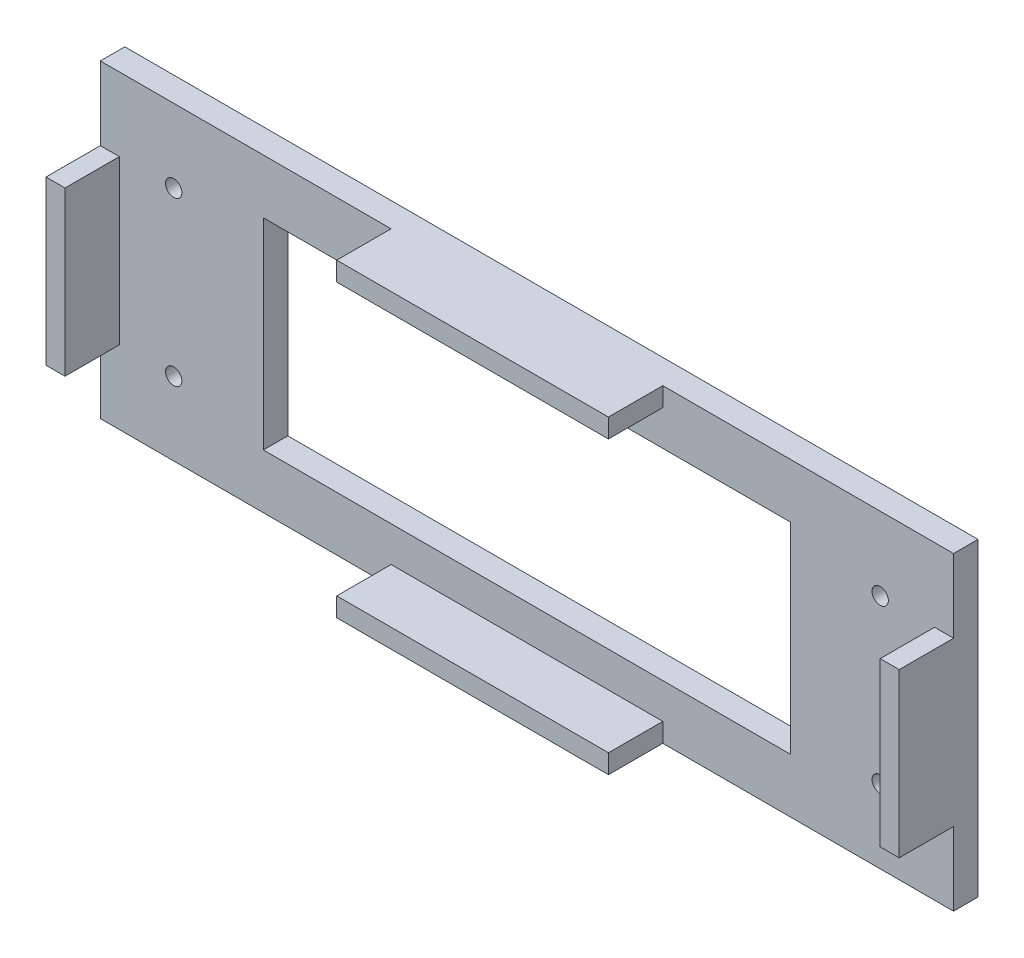
ISO-10303-21;
HEADER;
FILE_DESCRIPTION(('STEP AP214'),'2;1');
FILE_NAME('part.step','',(''),(''),'','','');
FILE_SCHEMA(('AUTOMOTIVE_DESIGN { 1 0 10303 214 1 1 1 1 }'));
ENDSEC;
DATA;
#1=APPLICATION_CONTEXT('core data for automotive mechanical design processes');
#2=APPLICATION_PROTOCOL_DEFINITION('international standard','automotive_design',2000,#1);
#3=PRODUCT_CONTEXT('',#1,'mechanical');
#4=PRODUCT('Part','Part','',(#3));
#5=PRODUCT_RELATED_PRODUCT_CATEGORY('part','',(#4));
#6=PRODUCT_DEFINITION_FORMATION('','',#4);
#7=PRODUCT_DEFINITION_CONTEXT('part definition',#1,'design');
#8=PRODUCT_DEFINITION('design','',#6,#7);
#9=PRODUCT_DEFINITION_SHAPE('','',#8);
#10=(LENGTH_UNIT() NAMED_UNIT(*) SI_UNIT(.MILLI.,.METRE.));
#11=(NAMED_UNIT(*) PLANE_ANGLE_UNIT() SI_UNIT($,.RADIAN.));
#12=(NAMED_UNIT(*) SI_UNIT($,.STERADIAN.) SOLID_ANGLE_UNIT());
#13=UNCERTAINTY_MEASURE_WITH_UNIT(LENGTH_MEASURE(1.E-05),#10,'distance_accuracy_value','');
#14=(GEOMETRIC_REPRESENTATION_CONTEXT(3) GLOBAL_UNCERTAINTY_ASSIGNED_CONTEXT((#13)) GLOBAL_UNIT_ASSIGNED_CONTEXT((#10,
#11,#12)) REPRESENTATION_CONTEXT('',''));
#15=CARTESIAN_POINT('',(0.,0.,0.));
#16=DIRECTION('',(0.,0.,1.));
#17=DIRECTION('',(1.,0.,0.));
#18=AXIS2_PLACEMENT_3D('',#15,#16,#17);
#19=CARTESIAN_POINT('',(0.,0.,4.5));
#20=DIRECTION('',(0.,0.,1.));
#21=DIRECTION('',(1.,0.,0.));
#22=AXIS2_PLACEMENT_3D('',#19,#20,#21);
#23=PLANE('',#22);
#24=CARTESIAN_POINT('',(-65.,-15.,4.5));
#25=DIRECTION('',(0.,0.,1.));
#26=DIRECTION('',(1.,0.,0.));
#27=AXIS2_PLACEMENT_3D('',#24,#25,#26);
#28=CIRCLE('',#27,1.5);
#29=CARTESIAN_POINT('',(-63.5,-15.,4.5));
#30=VERTEX_POINT('',#29);
#31=EDGE_CURVE('E349',#30,#30,#28,.T.);
#32=ORIENTED_EDGE('',*,*,#31,.F.);
#33=EDGE_LOOP('',(#32));
#34=FACE_BOUND('',#33,.T.);
#35=CARTESIAN_POINT('',(-65.,15.,4.5));
#36=DIRECTION('',(0.,0.,1.));
#37=DIRECTION('',(1.,0.,0.));
#38=AXIS2_PLACEMENT_3D('',#35,#36,#37);
#39=CIRCLE('',#38,1.5);
#40=CARTESIAN_POINT('',(-63.5,15.,4.5));
#41=VERTEX_POINT('',#40);
#42=EDGE_CURVE('E361',#41,#41,#39,.T.);
#43=ORIENTED_EDGE('',*,*,#42,.F.);
#44=EDGE_LOOP('',(#43));
#45=FACE_BOUND('',#44,.T.);
#46=CARTESIAN_POINT('',(65.,15.,4.5));
#47=DIRECTION('',(0.,0.,1.));
#48=DIRECTION('',(1.,0.,0.));
#49=AXIS2_PLACEMENT_3D('',#46,#47,#48);
#50=CIRCLE('',#49,1.5);
#51=CARTESIAN_POINT('',(66.5,15.,4.5));
#52=VERTEX_POINT('',#51);
#53=EDGE_CURVE('E355',#52,#52,#50,.T.);
#54=ORIENTED_EDGE('',*,*,#53,.F.);
#55=EDGE_LOOP('',(#54));
#56=FACE_BOUND('',#55,.T.);
#57=CARTESIAN_POINT('',(65.,-15.,4.5));
#58=DIRECTION('',(0.,0.,1.));
#59=DIRECTION('',(1.,0.,0.));
#60=AXIS2_PLACEMENT_3D('',#57,#58,#59);
#61=CIRCLE('',#60,1.5);
#62=CARTESIAN_POINT('',(66.5,-15.,4.5));
#63=VERTEX_POINT('',#62);
#64=EDGE_CURVE('E343',#63,#63,#61,.T.);
#65=ORIENTED_EDGE('',*,*,#64,.F.);
#66=EDGE_LOOP('',(#65));
#67=FACE_BOUND('',#66,.T.);
#68=DIRECTION('',(-1.,0.,0.));
#69=VECTOR('',#68,1.);
#70=CARTESIAN_POINT('',(-48.5,18.5,4.5));
#71=LINE('',#70,#69);
#72=CARTESIAN_POINT('',(48.5,18.5,4.5));
#73=VERTEX_POINT('',#72);
#74=CARTESIAN_POINT('',(-48.5,18.5,4.5));
#75=VERTEX_POINT('',#74);
#76=EDGE_CURVE('E314',#73,#75,#71,.T.);
#77=ORIENTED_EDGE('',*,*,#76,.F.);
#78=DIRECTION('',(0.,1.,0.));
#79=VECTOR('',#78,1.);
#80=CARTESIAN_POINT('',(48.5,18.5,4.5));
#81=LINE('',#80,#79);
#82=CARTESIAN_POINT('',(48.5,-18.5,4.5));
#83=VERTEX_POINT('',#82);
#84=EDGE_CURVE('E312',#83,#73,#81,.T.);
#85=ORIENTED_EDGE('',*,*,#84,.F.);
#86=DIRECTION('',(1.,0.,0.));
#87=VECTOR('',#86,1.);
#88=CARTESIAN_POINT('',(-48.5,-18.5,4.5));
#89=LINE('',#88,#87);
#90=CARTESIAN_POINT('',(-48.5,-18.5,4.5));
#91=VERTEX_POINT('',#90);
#92=EDGE_CURVE('E320',#91,#83,#89,.T.);
#93=ORIENTED_EDGE('',*,*,#92,.F.);
#94=DIRECTION('',(0.,-1.,0.));
#95=VECTOR('',#94,1.);
#96=CARTESIAN_POINT('',(-48.5,18.5,4.5));
#97=LINE('',#96,#95);
#98=EDGE_CURVE('E317',#75,#91,#97,.T.);
#99=ORIENTED_EDGE('',*,*,#98,.F.);
#100=EDGE_LOOP('',(#77,#85,#93,#99));
#101=FACE_BOUND('',#100,.T.);
#102=DIRECTION('',(-1.,0.,0.));
#103=VECTOR('',#102,1.);
#104=CARTESIAN_POINT('',(-25.,-25.,4.5));
#105=LINE('',#104,#103);
#106=CARTESIAN_POINT('',(25.,-25.,4.5));
#107=VERTEX_POINT('',#106);
#108=CARTESIAN_POINT('',(-25.,-25.,4.5));
#109=VERTEX_POINT('',#108);
#110=EDGE_CURVE('E49',#107,#109,#105,.T.);
#111=ORIENTED_EDGE('',*,*,#110,.F.);
#112=DIRECTION('',(0.,1.,0.));
#113=VECTOR('',#112,1.);
#114=CARTESIAN_POINT('',(25.,-25.,4.5));
#115=LINE('',#114,#113);
#116=CARTESIAN_POINT('',(25.,-28.5,4.5));
#117=VERTEX_POINT('',#116);
#118=EDGE_CURVE('E215',#117,#107,#115,.T.);
#119=ORIENTED_EDGE('',*,*,#118,.F.);
#120=DIRECTION('',(1.,0.,0.));
#121=VECTOR('',#120,1.);
#122=CARTESIAN_POINT('',(-78.5,-28.5,4.5));
#123=LINE('',#122,#121);
#124=CARTESIAN_POINT('',(78.5,-28.5,4.5));
#125=VERTEX_POINT('',#124);
#126=EDGE_CURVE('E376',#117,#125,#123,.T.);
#127=ORIENTED_EDGE('',*,*,#126,.T.);
#128=DIRECTION('',(0.,1.,0.));
#129=VECTOR('',#128,1.);
#130=CARTESIAN_POINT('',(78.5,28.5,4.5));
#131=LINE('',#130,#129);
#132=CARTESIAN_POINT('',(78.5,-15.,4.5));
#133=VERTEX_POINT('',#132);
#134=EDGE_CURVE('E367',#125,#133,#131,.T.);
#135=ORIENTED_EDGE('',*,*,#134,.T.);
#136=DIRECTION('',(1.,0.,0.));
#137=VECTOR('',#136,1.);
#138=CARTESIAN_POINT('',(75.,-15.,4.5));
#139=LINE('',#138,#137);
#140=CARTESIAN_POINT('',(75.,-15.,4.5));
#141=VERTEX_POINT('',#140);
#142=EDGE_CURVE('E256',#141,#133,#139,.T.);
#143=ORIENTED_EDGE('',*,*,#142,.F.);
#144=DIRECTION('',(0.,-1.,0.));
#145=VECTOR('',#144,1.);
#146=CARTESIAN_POINT('',(75.,-15.,4.5));
#147=LINE('',#146,#145);
#148=CARTESIAN_POINT('',(75.,15.,4.5));
#149=VERTEX_POINT('',#148);
#150=EDGE_CURVE('E265',#149,#141,#147,.T.);
#151=ORIENTED_EDGE('',*,*,#150,.F.);
#152=DIRECTION('',(-1.,0.,0.));
#153=VECTOR('',#152,1.);
#154=CARTESIAN_POINT('',(75.,15.,4.5));
#155=LINE('',#154,#153);
#156=CARTESIAN_POINT('',(78.5,15.,4.5));
#157=VERTEX_POINT('',#156);
#158=EDGE_CURVE('E251',#157,#149,#155,.T.);
#159=ORIENTED_EDGE('',*,*,#158,.F.);
#160=CARTESIAN_POINT('',(78.5,28.5,4.5));
#161=VERTEX_POINT('',#160);
#162=EDGE_CURVE('E370',#157,#161,#131,.T.);
#163=ORIENTED_EDGE('',*,*,#162,.T.);
#164=DIRECTION('',(-1.,0.,0.));
#165=VECTOR('',#164,1.);
#166=CARTESIAN_POINT('',(-78.5,28.5,4.5));
#167=LINE('',#166,#165);
#168=CARTESIAN_POINT('',(25.,28.5,4.5));
#169=VERTEX_POINT('',#168);
#170=EDGE_CURVE('E371',#161,#169,#167,.T.);
#171=ORIENTED_EDGE('',*,*,#170,.T.);
#172=DIRECTION('',(0.,1.,0.));
#173=VECTOR('',#172,1.);
#174=CARTESIAN_POINT('',(25.,25.,4.5));
#175=LINE('',#174,#173);
#176=CARTESIAN_POINT('',(25.,25.,4.5));
#177=VERTEX_POINT('',#176);
#178=EDGE_CURVE('E216',#177,#169,#175,.T.);
#179=ORIENTED_EDGE('',*,*,#178,.F.);
#180=DIRECTION('',(1.,0.,0.));
#181=VECTOR('',#180,1.);
#182=CARTESIAN_POINT('',(-25.,25.,4.5));
#183=LINE('',#182,#181);
#184=CARTESIAN_POINT('',(-25.,25.,4.5));
#185=VERTEX_POINT('',#184);
#186=EDGE_CURVE('E229',#185,#177,#183,.T.);
#187=ORIENTED_EDGE('',*,*,#186,.F.);
#188=DIRECTION('',(0.,-1.,0.));
#189=VECTOR('',#188,1.);
#190=CARTESIAN_POINT('',(-25.,25.,4.5));
#191=LINE('',#190,#189);
#192=CARTESIAN_POINT('',(-25.,28.5,4.5));
#193=VERTEX_POINT('',#192);
#194=EDGE_CURVE('E219',#193,#185,#191,.T.);
#195=ORIENTED_EDGE('',*,*,#194,.F.);
#196=CARTESIAN_POINT('',(-78.5,28.5,4.5));
#197=VERTEX_POINT('',#196);
#198=EDGE_CURVE('E369',#193,#197,#167,.T.);
#199=ORIENTED_EDGE('',*,*,#198,.T.);
#200=DIRECTION('',(0.,-1.,0.));
#201=VECTOR('',#200,1.);
#202=CARTESIAN_POINT('',(-78.5,28.5,4.5));
#203=LINE('',#202,#201);
#204=CARTESIAN_POINT('',(-78.5,15.,4.5));
#205=VERTEX_POINT('',#204);
#206=EDGE_CURVE('E374',#197,#205,#203,.T.);
#207=ORIENTED_EDGE('',*,*,#206,.T.);
#208=DIRECTION('',(-1.,0.,0.));
#209=VECTOR('',#208,1.);
#210=CARTESIAN_POINT('',(-75.,15.,4.5));
#211=LINE('',#210,#209);
#212=CARTESIAN_POINT('',(-75.,15.,4.5));
#213=VERTEX_POINT('',#212);
#214=EDGE_CURVE('E286',#213,#205,#211,.T.);
#215=ORIENTED_EDGE('',*,*,#214,.F.);
#216=DIRECTION('',(0.,1.,0.));
#217=VECTOR('',#216,1.);
#218=CARTESIAN_POINT('',(-75.,-15.,4.5));
#219=LINE('',#218,#217);
#220=CARTESIAN_POINT('',(-75.,-15.,4.5));
#221=VERTEX_POINT('',#220);
#222=EDGE_CURVE('E295',#221,#213,#219,.T.);
#223=ORIENTED_EDGE('',*,*,#222,.F.);
#224=DIRECTION('',(1.,0.,0.));
#225=VECTOR('',#224,1.);
#226=CARTESIAN_POINT('',(-75.,-15.,4.5));
#227=LINE('',#226,#225);
#228=CARTESIAN_POINT('',(-78.5,-15.,4.5));
#229=VERTEX_POINT('',#228);
#230=EDGE_CURVE('E281',#229,#221,#227,.T.);
#231=ORIENTED_EDGE('',*,*,#230,.F.);
#232=CARTESIAN_POINT('',(-78.5,-28.5,4.5));
#233=VERTEX_POINT('',#232);
#234=EDGE_CURVE('E373',#229,#233,#203,.T.);
#235=ORIENTED_EDGE('',*,*,#234,.T.);
#236=CARTESIAN_POINT('',(-25.,-28.5,4.5));
#237=VERTEX_POINT('',#236);
#238=EDGE_CURVE('E377',#233,#237,#123,.T.);
#239=ORIENTED_EDGE('',*,*,#238,.T.);
#240=DIRECTION('',(0.,-1.,0.));
#241=VECTOR('',#240,1.);
#242=CARTESIAN_POINT('',(-25.,-25.,4.5));
#243=LINE('',#242,#241);
#244=EDGE_CURVE('E54',#109,#237,#243,.T.);
#245=ORIENTED_EDGE('',*,*,#244,.F.);
#246=EDGE_LOOP('',(#111,#119,#127,#135,#143,#151,#159,#163,#171,#179,#187,#195,#199,#207,#215,
#223,#231,#235,#239,#245));
#247=FACE_BOUND('',#246,.T.);
#248=ADVANCED_FACE('F34',(#34,#45,#56,#67,#101,#247),#23,.T.);
#249=CARTESIAN_POINT('',(0.,0.,0.));
#250=DIRECTION('',(0.,0.,1.));
#251=DIRECTION('',(1.,0.,0.));
#252=AXIS2_PLACEMENT_3D('',#249,#250,#251);
#253=PLANE('',#252);
#254=CARTESIAN_POINT('',(65.,-15.,0.));
#255=DIRECTION('',(0.,0.,1.));
#256=DIRECTION('',(1.,0.,0.));
#257=AXIS2_PLACEMENT_3D('',#254,#255,#256);
#258=CIRCLE('',#257,1.5);
#259=CARTESIAN_POINT('',(66.5,-15.,0.));
#260=VERTEX_POINT('',#259);
#261=EDGE_CURVE('E342',#260,#260,#258,.T.);
#262=ORIENTED_EDGE('',*,*,#261,.T.);
#263=EDGE_LOOP('',(#262));
#264=FACE_BOUND('',#263,.T.);
#265=CARTESIAN_POINT('',(-65.,-15.,0.));
#266=DIRECTION('',(0.,0.,1.));
#267=DIRECTION('',(1.,0.,0.));
#268=AXIS2_PLACEMENT_3D('',#265,#266,#267);
#269=CIRCLE('',#268,1.5);
#270=CARTESIAN_POINT('',(-63.5,-15.,0.));
#271=VERTEX_POINT('',#270);
#272=EDGE_CURVE('E346',#271,#271,#269,.T.);
#273=ORIENTED_EDGE('',*,*,#272,.T.);
#274=EDGE_LOOP('',(#273));
#275=FACE_BOUND('',#274,.T.);
#276=CARTESIAN_POINT('',(65.,15.,0.));
#277=DIRECTION('',(0.,0.,1.));
#278=DIRECTION('',(1.,0.,0.));
#279=AXIS2_PLACEMENT_3D('',#276,#277,#278);
#280=CIRCLE('',#279,1.5);
#281=CARTESIAN_POINT('',(66.5,15.,0.));
#282=VERTEX_POINT('',#281);
#283=EDGE_CURVE('E352',#282,#282,#280,.T.);
#284=ORIENTED_EDGE('',*,*,#283,.T.);
#285=EDGE_LOOP('',(#284));
#286=FACE_BOUND('',#285,.T.);
#287=CARTESIAN_POINT('',(-65.,15.,0.));
#288=DIRECTION('',(0.,0.,1.));
#289=DIRECTION('',(1.,0.,0.));
#290=AXIS2_PLACEMENT_3D('',#287,#288,#289);
#291=CIRCLE('',#290,1.5);
#292=CARTESIAN_POINT('',(-63.5,15.,0.));
#293=VERTEX_POINT('',#292);
#294=EDGE_CURVE('E358',#293,#293,#291,.T.);
#295=ORIENTED_EDGE('',*,*,#294,.T.);
#296=EDGE_LOOP('',(#295));
#297=FACE_BOUND('',#296,.T.);
#298=DIRECTION('',(0.,1.,0.));
#299=VECTOR('',#298,1.);
#300=CARTESIAN_POINT('',(78.5,28.5,0.));
#301=LINE('',#300,#299);
#302=CARTESIAN_POINT('',(78.5,-28.5,0.));
#303=VERTEX_POINT('',#302);
#304=CARTESIAN_POINT('',(78.5,28.5,0.));
#305=VERTEX_POINT('',#304);
#306=EDGE_CURVE('E364',#303,#305,#301,.T.);
#307=ORIENTED_EDGE('',*,*,#306,.F.);
#308=DIRECTION('',(1.,0.,0.));
#309=VECTOR('',#308,1.);
#310=CARTESIAN_POINT('',(-78.5,-28.5,0.));
#311=LINE('',#310,#309);
#312=CARTESIAN_POINT('',(-78.5,-28.5,0.));
#313=VERTEX_POINT('',#312);
#314=EDGE_CURVE('E386',#313,#303,#311,.T.);
#315=ORIENTED_EDGE('',*,*,#314,.F.);
#316=DIRECTION('',(0.,-1.,0.));
#317=VECTOR('',#316,1.);
#318=CARTESIAN_POINT('',(-78.5,28.5,0.));
#319=LINE('',#318,#317);
#320=CARTESIAN_POINT('',(-78.5,28.5,0.));
#321=VERTEX_POINT('',#320);
#322=EDGE_CURVE('E384',#321,#313,#319,.T.);
#323=ORIENTED_EDGE('',*,*,#322,.F.);
#324=DIRECTION('',(-1.,0.,0.));
#325=VECTOR('',#324,1.);
#326=CARTESIAN_POINT('',(-78.5,28.5,0.));
#327=LINE('',#326,#325);
#328=EDGE_CURVE('E382',#305,#321,#327,.T.);
#329=ORIENTED_EDGE('',*,*,#328,.F.);
#330=EDGE_LOOP('',(#307,#315,#323,#329));
#331=FACE_BOUND('',#330,.T.);
#332=DIRECTION('',(0.,1.,0.));
#333=VECTOR('',#332,1.);
#334=CARTESIAN_POINT('',(48.5,18.5,0.));
#335=LINE('',#334,#333);
#336=CARTESIAN_POINT('',(48.5,-18.5,0.));
#337=VERTEX_POINT('',#336);
#338=CARTESIAN_POINT('',(48.5,18.5,0.));
#339=VERTEX_POINT('',#338);
#340=EDGE_CURVE('E311',#337,#339,#335,.T.);
#341=ORIENTED_EDGE('',*,*,#340,.T.);
#342=DIRECTION('',(-1.,0.,0.));
#343=VECTOR('',#342,1.);
#344=CARTESIAN_POINT('',(-48.5,18.5,0.));
#345=LINE('',#344,#343);
#346=CARTESIAN_POINT('',(-48.5,18.5,0.));
#347=VERTEX_POINT('',#346);
#348=EDGE_CURVE('E325',#339,#347,#345,.T.);
#349=ORIENTED_EDGE('',*,*,#348,.T.);
#350=DIRECTION('',(0.,-1.,0.));
#351=VECTOR('',#350,1.);
#352=CARTESIAN_POINT('',(-48.5,18.5,0.));
#353=LINE('',#352,#351);
#354=CARTESIAN_POINT('',(-48.5,-18.5,0.));
#355=VERTEX_POINT('',#354);
#356=EDGE_CURVE('E328',#347,#355,#353,.T.);
#357=ORIENTED_EDGE('',*,*,#356,.T.);
#358=DIRECTION('',(1.,0.,0.));
#359=VECTOR('',#358,1.);
#360=CARTESIAN_POINT('',(-48.5,-18.5,0.));
#361=LINE('',#360,#359);
#362=EDGE_CURVE('E315',#355,#337,#361,.T.);
#363=ORIENTED_EDGE('',*,*,#362,.T.);
#364=EDGE_LOOP('',(#341,#349,#357,#363));
#365=FACE_BOUND('',#364,.T.);
#366=ADVANCED_FACE('F403',(#264,#275,#286,#297,#331,#365),#253,.F.);
#367=CARTESIAN_POINT('',(78.5,28.5,4.5));
#368=DIRECTION('',(-1.,0.,0.));
#369=DIRECTION('',(0.,0.,1.));
#370=AXIS2_PLACEMENT_3D('',#367,#368,#369);
#371=PLANE('',#370);
#372=ORIENTED_EDGE('',*,*,#306,.T.);
#373=DIRECTION('',(0.,0.,-1.));
#374=VECTOR('',#373,1.);
#375=CARTESIAN_POINT('',(78.5,28.5,4.5));
#376=LINE('',#375,#374);
#377=EDGE_CURVE('E11',#161,#305,#376,.T.);
#378=ORIENTED_EDGE('',*,*,#377,.F.);
#379=ORIENTED_EDGE('',*,*,#162,.F.);
#380=DIRECTION('',(0.,0.,-1.));
#381=VECTOR('',#380,1.);
#382=CARTESIAN_POINT('',(78.5,15.,14.5));
#383=LINE('',#382,#381);
#384=CARTESIAN_POINT('',(78.5,15.,14.5));
#385=VERTEX_POINT('',#384);
#386=EDGE_CURVE('E278',#385,#157,#383,.T.);
#387=ORIENTED_EDGE('',*,*,#386,.F.);
#388=DIRECTION('',(0.,1.,0.));
#389=VECTOR('',#388,1.);
#390=CARTESIAN_POINT('',(78.5,-15.,14.5));
#391=LINE('',#390,#389);
#392=CARTESIAN_POINT('',(78.5,-15.,14.5));
#393=VERTEX_POINT('',#392);
#394=EDGE_CURVE('E252',#393,#385,#391,.T.);
#395=ORIENTED_EDGE('',*,*,#394,.F.);
#396=DIRECTION('',(0.,0.,-1.));
#397=VECTOR('',#396,1.);
#398=CARTESIAN_POINT('',(78.5,-15.,14.5));
#399=LINE('',#398,#397);
#400=EDGE_CURVE('E262',#393,#133,#399,.T.);
#401=ORIENTED_EDGE('',*,*,#400,.T.);
#402=ORIENTED_EDGE('',*,*,#134,.F.);
#403=DIRECTION('',(0.,0.,-1.));
#404=VECTOR('',#403,1.);
#405=CARTESIAN_POINT('',(78.5,-28.5,4.5));
#406=LINE('',#405,#404);
#407=EDGE_CURVE('E379',#125,#303,#406,.T.);
#408=ORIENTED_EDGE('',*,*,#407,.T.);
#409=EDGE_LOOP('',(#372,#378,#379,#387,#395,#401,#402,#408));
#410=FACE_BOUND('',#409,.T.);
#411=ADVANCED_FACE('F36',(#410),#371,.F.);
#412=CARTESIAN_POINT('',(-78.5,28.5,4.5));
#413=DIRECTION('',(0.,-1.,0.));
#414=DIRECTION('',(0.,0.,-1.));
#415=AXIS2_PLACEMENT_3D('',#412,#413,#414);
#416=PLANE('',#415);
#417=ORIENTED_EDGE('',*,*,#328,.T.);
#418=DIRECTION('',(0.,0.,-1.));
#419=VECTOR('',#418,1.);
#420=CARTESIAN_POINT('',(-78.5,28.5,4.5));
#421=LINE('',#420,#419);
#422=EDGE_CURVE('E42',#197,#321,#421,.T.);
#423=ORIENTED_EDGE('',*,*,#422,.F.);
#424=ORIENTED_EDGE('',*,*,#198,.F.);
#425=DIRECTION('',(0.,0.,-1.));
#426=VECTOR('',#425,1.);
#427=CARTESIAN_POINT('',(-25.,28.5,14.5));
#428=LINE('',#427,#426);
#429=CARTESIAN_POINT('',(-25.,28.5,14.5));
#430=VERTEX_POINT('',#429);
#431=EDGE_CURVE('E245',#430,#193,#428,.T.);
#432=ORIENTED_EDGE('',*,*,#431,.F.);
#433=DIRECTION('',(-1.,0.,0.));
#434=VECTOR('',#433,1.);
#435=CARTESIAN_POINT('',(-25.,28.5,14.5));
#436=LINE('',#435,#434);
#437=CARTESIAN_POINT('',(25.,28.5,14.5));
#438=VERTEX_POINT('',#437);
#439=EDGE_CURVE('E228',#438,#430,#436,.T.);
#440=ORIENTED_EDGE('',*,*,#439,.F.);
#441=DIRECTION('',(0.,0.,-1.));
#442=VECTOR('',#441,1.);
#443=CARTESIAN_POINT('',(25.,28.5,14.5));
#444=LINE('',#443,#442);
#445=EDGE_CURVE('E248',#438,#169,#444,.T.);
#446=ORIENTED_EDGE('',*,*,#445,.T.);
#447=ORIENTED_EDGE('',*,*,#170,.F.);
#448=ORIENTED_EDGE('',*,*,#377,.T.);
#449=EDGE_LOOP('',(#417,#423,#424,#432,#440,#446,#447,#448));
#450=FACE_BOUND('',#449,.T.);
#451=ADVANCED_FACE('F427',(#450),#416,.F.);
#452=CARTESIAN_POINT('',(-78.5,28.5,4.5));
#453=DIRECTION('',(1.,0.,0.));
#454=DIRECTION('',(0.,0.,-1.));
#455=AXIS2_PLACEMENT_3D('',#452,#453,#454);
#456=PLANE('',#455);
#457=ORIENTED_EDGE('',*,*,#322,.T.);
#458=DIRECTION('',(0.,0.,-1.));
#459=VECTOR('',#458,1.);
#460=CARTESIAN_POINT('',(-78.5,-28.5,4.5));
#461=LINE('',#460,#459);
#462=EDGE_CURVE('E390',#233,#313,#461,.T.);
#463=ORIENTED_EDGE('',*,*,#462,.F.);
#464=ORIENTED_EDGE('',*,*,#234,.F.);
#465=DIRECTION('',(0.,0.,-1.));
#466=VECTOR('',#465,1.);
#467=CARTESIAN_POINT('',(-78.5,-15.,14.5));
#468=LINE('',#467,#466);
#469=CARTESIAN_POINT('',(-78.5,-15.,14.5));
#470=VERTEX_POINT('',#469);
#471=EDGE_CURVE('E308',#470,#229,#468,.T.);
#472=ORIENTED_EDGE('',*,*,#471,.F.);
#473=DIRECTION('',(0.,-1.,0.));
#474=VECTOR('',#473,1.);
#475=CARTESIAN_POINT('',(-78.5,-15.,14.5));
#476=LINE('',#475,#474);
#477=CARTESIAN_POINT('',(-78.5,15.,14.5));
#478=VERTEX_POINT('',#477);
#479=EDGE_CURVE('E282',#478,#470,#476,.T.);
#480=ORIENTED_EDGE('',*,*,#479,.F.);
#481=DIRECTION('',(0.,0.,-1.));
#482=VECTOR('',#481,1.);
#483=CARTESIAN_POINT('',(-78.5,15.,14.5));
#484=LINE('',#483,#482);
#485=EDGE_CURVE('E292',#478,#205,#484,.T.);
#486=ORIENTED_EDGE('',*,*,#485,.T.);
#487=ORIENTED_EDGE('',*,*,#206,.F.);
#488=ORIENTED_EDGE('',*,*,#422,.T.);
#489=EDGE_LOOP('',(#457,#463,#464,#472,#480,#486,#487,#488));
#490=FACE_BOUND('',#489,.T.);
#491=ADVANCED_FACE('F397',(#490),#456,.F.);
#492=CARTESIAN_POINT('',(-78.5,-28.5,4.5));
#493=DIRECTION('',(0.,1.,0.));
#494=DIRECTION('',(0.,0.,1.));
#495=AXIS2_PLACEMENT_3D('',#492,#493,#494);
#496=PLANE('',#495);
#497=ORIENTED_EDGE('',*,*,#314,.T.);
#498=ORIENTED_EDGE('',*,*,#407,.F.);
#499=ORIENTED_EDGE('',*,*,#126,.F.);
#500=DIRECTION('',(0.,0.,-1.));
#501=VECTOR('',#500,1.);
#502=CARTESIAN_POINT('',(25.,-28.5,14.5));
#503=LINE('',#502,#501);
#504=CARTESIAN_POINT('',(25.,-28.5,14.5));
#505=VERTEX_POINT('',#504);
#506=EDGE_CURVE('E735',#505,#117,#503,.T.);
#507=ORIENTED_EDGE('',*,*,#506,.F.);
#508=DIRECTION('',(1.,0.,0.));
#509=VECTOR('',#508,1.);
#510=CARTESIAN_POINT('',(-25.,-28.5,14.5));
#511=LINE('',#510,#509);
#512=CARTESIAN_POINT('',(-25.,-28.5,14.5));
#513=VERTEX_POINT('',#512);
#514=EDGE_CURVE('E209',#513,#505,#511,.T.);
#515=ORIENTED_EDGE('',*,*,#514,.F.);
#516=DIRECTION('',(0.,0.,-1.));
#517=VECTOR('',#516,1.);
#518=CARTESIAN_POINT('',(-25.,-28.5,14.5));
#519=LINE('',#518,#517);
#520=EDGE_CURVE('E221',#513,#237,#519,.T.);
#521=ORIENTED_EDGE('',*,*,#520,.T.);
#522=ORIENTED_EDGE('',*,*,#238,.F.);
#523=ORIENTED_EDGE('',*,*,#462,.T.);
#524=EDGE_LOOP('',(#497,#498,#499,#507,#515,#521,#522,#523));
#525=FACE_BOUND('',#524,.T.);
#526=ADVANCED_FACE('F407',(#525),#496,.F.);
#527=CARTESIAN_POINT('',(-65.,15.,4.5));
#528=DIRECTION('',(0.,0.,-1.));
#529=DIRECTION('',(-1.,0.,0.));
#530=AXIS2_PLACEMENT_3D('',#527,#528,#529);
#531=CYLINDRICAL_SURFACE('',#530,1.5);
#532=ORIENTED_EDGE('',*,*,#42,.T.);
#533=EDGE_LOOP('',(#532));
#534=FACE_BOUND('',#533,.T.);
#535=ORIENTED_EDGE('',*,*,#294,.F.);
#536=EDGE_LOOP('',(#535));
#537=FACE_BOUND('',#536,.T.);
#538=ADVANCED_FACE('F480',(#534,#537),#531,.F.);
#539=CARTESIAN_POINT('',(65.,15.,4.5));
#540=DIRECTION('',(0.,0.,-1.));
#541=DIRECTION('',(-1.,0.,0.));
#542=AXIS2_PLACEMENT_3D('',#539,#540,#541);
#543=CYLINDRICAL_SURFACE('',#542,1.5);
#544=ORIENTED_EDGE('',*,*,#53,.T.);
#545=EDGE_LOOP('',(#544));
#546=FACE_BOUND('',#545,.T.);
#547=ORIENTED_EDGE('',*,*,#283,.F.);
#548=EDGE_LOOP('',(#547));
#549=FACE_BOUND('',#548,.T.);
#550=ADVANCED_FACE('F506',(#546,#549),#543,.F.);
#551=CARTESIAN_POINT('',(-65.,-15.,4.5));
#552=DIRECTION('',(0.,0.,-1.));
#553=DIRECTION('',(-1.,0.,0.));
#554=AXIS2_PLACEMENT_3D('',#551,#552,#553);
#555=CYLINDRICAL_SURFACE('',#554,1.5);
#556=ORIENTED_EDGE('',*,*,#31,.T.);
#557=EDGE_LOOP('',(#556));
#558=FACE_BOUND('',#557,.T.);
#559=ORIENTED_EDGE('',*,*,#272,.F.);
#560=EDGE_LOOP('',(#559));
#561=FACE_BOUND('',#560,.T.);
#562=ADVANCED_FACE('F516',(#558,#561),#555,.F.);
#563=CARTESIAN_POINT('',(65.,-15.,4.5));
#564=DIRECTION('',(0.,0.,-1.));
#565=DIRECTION('',(-1.,0.,0.));
#566=AXIS2_PLACEMENT_3D('',#563,#564,#565);
#567=CYLINDRICAL_SURFACE('',#566,1.5);
#568=ORIENTED_EDGE('',*,*,#64,.T.);
#569=EDGE_LOOP('',(#568));
#570=FACE_BOUND('',#569,.T.);
#571=ORIENTED_EDGE('',*,*,#261,.F.);
#572=EDGE_LOOP('',(#571));
#573=FACE_BOUND('',#572,.T.);
#574=ADVANCED_FACE('F525',(#570,#573),#567,.F.);
#575=CARTESIAN_POINT('',(48.5,18.5,4.5));
#576=DIRECTION('',(-1.,0.,0.));
#577=DIRECTION('',(0.,0.,1.));
#578=AXIS2_PLACEMENT_3D('',#575,#576,#577);
#579=PLANE('',#578);
#580=ORIENTED_EDGE('',*,*,#340,.F.);
#581=DIRECTION('',(0.,0.,-1.));
#582=VECTOR('',#581,1.);
#583=CARTESIAN_POINT('',(48.5,-18.5,4.5));
#584=LINE('',#583,#582);
#585=EDGE_CURVE('E322',#83,#337,#584,.T.);
#586=ORIENTED_EDGE('',*,*,#585,.F.);
#587=ORIENTED_EDGE('',*,*,#84,.T.);
#588=DIRECTION('',(0.,0.,-1.));
#589=VECTOR('',#588,1.);
#590=CARTESIAN_POINT('',(48.5,18.5,4.5));
#591=LINE('',#590,#589);
#592=EDGE_CURVE('E339',#73,#339,#591,.T.);
#593=ORIENTED_EDGE('',*,*,#592,.T.);
#594=EDGE_LOOP('',(#580,#586,#587,#593));
#595=FACE_BOUND('',#594,.T.);
#596=ADVANCED_FACE('F535',(#595),#579,.T.);
#597=CARTESIAN_POINT('',(-48.5,18.5,4.5));
#598=DIRECTION('',(0.,-1.,0.));
#599=DIRECTION('',(0.,0.,-1.));
#600=AXIS2_PLACEMENT_3D('',#597,#598,#599);
#601=PLANE('',#600);
#602=ORIENTED_EDGE('',*,*,#348,.F.);
#603=ORIENTED_EDGE('',*,*,#592,.F.);
#604=ORIENTED_EDGE('',*,*,#76,.T.);
#605=DIRECTION('',(0.,0.,-1.));
#606=VECTOR('',#605,1.);
#607=CARTESIAN_POINT('',(-48.5,18.5,4.5));
#608=LINE('',#607,#606);
#609=EDGE_CURVE('E337',#75,#347,#608,.T.);
#610=ORIENTED_EDGE('',*,*,#609,.T.);
#611=EDGE_LOOP('',(#602,#603,#604,#610));
#612=FACE_BOUND('',#611,.T.);
#613=ADVANCED_FACE('F545',(#612),#601,.T.);
#614=CARTESIAN_POINT('',(-48.5,18.5,4.5));
#615=DIRECTION('',(1.,0.,0.));
#616=DIRECTION('',(0.,0.,-1.));
#617=AXIS2_PLACEMENT_3D('',#614,#615,#616);
#618=PLANE('',#617);
#619=ORIENTED_EDGE('',*,*,#356,.F.);
#620=ORIENTED_EDGE('',*,*,#609,.F.);
#621=ORIENTED_EDGE('',*,*,#98,.T.);
#622=DIRECTION('',(0.,0.,-1.));
#623=VECTOR('',#622,1.);
#624=CARTESIAN_POINT('',(-48.5,-18.5,4.5));
#625=LINE('',#624,#623);
#626=EDGE_CURVE('E335',#91,#355,#625,.T.);
#627=ORIENTED_EDGE('',*,*,#626,.T.);
#628=EDGE_LOOP('',(#619,#620,#621,#627));
#629=FACE_BOUND('',#628,.T.);
#630=ADVANCED_FACE('F466',(#629),#618,.T.);
#631=CARTESIAN_POINT('',(-48.5,-18.5,4.5));
#632=DIRECTION('',(0.,1.,0.));
#633=DIRECTION('',(0.,0.,1.));
#634=AXIS2_PLACEMENT_3D('',#631,#632,#633);
#635=PLANE('',#634);
#636=ORIENTED_EDGE('',*,*,#362,.F.);
#637=ORIENTED_EDGE('',*,*,#626,.F.);
#638=ORIENTED_EDGE('',*,*,#92,.T.);
#639=ORIENTED_EDGE('',*,*,#585,.T.);
#640=EDGE_LOOP('',(#636,#637,#638,#639));
#641=FACE_BOUND('',#640,.T.);
#642=ADVANCED_FACE('F459',(#641),#635,.T.);
#643=CARTESIAN_POINT('',(-75.,-15.,14.5));
#644=DIRECTION('',(0.,1.,0.));
#645=DIRECTION('',(0.,0.,1.));
#646=AXIS2_PLACEMENT_3D('',#643,#644,#645);
#647=PLANE('',#646);
#648=ORIENTED_EDGE('',*,*,#230,.T.);
#649=DIRECTION('',(0.,0.,-1.));
#650=VECTOR('',#649,1.);
#651=CARTESIAN_POINT('',(-75.,-15.,14.5));
#652=LINE('',#651,#650);
#653=CARTESIAN_POINT('',(-75.,-15.,14.5));
#654=VERTEX_POINT('',#653);
#655=EDGE_CURVE('E305',#654,#221,#652,.T.);
#656=ORIENTED_EDGE('',*,*,#655,.F.);
#657=DIRECTION('',(1.,0.,0.));
#658=VECTOR('',#657,1.);
#659=CARTESIAN_POINT('',(-75.,-15.,14.5));
#660=LINE('',#659,#658);
#661=EDGE_CURVE('E285',#470,#654,#660,.T.);
#662=ORIENTED_EDGE('',*,*,#661,.F.);
#663=ORIENTED_EDGE('',*,*,#471,.T.);
#664=EDGE_LOOP('',(#648,#656,#662,#663));
#665=FACE_BOUND('',#664,.T.);
#666=ADVANCED_FACE('F457',(#665),#647,.F.);
#667=CARTESIAN_POINT('',(-75.,-15.,14.5));
#668=DIRECTION('',(-1.,0.,0.));
#669=DIRECTION('',(0.,0.,1.));
#670=AXIS2_PLACEMENT_3D('',#667,#668,#669);
#671=PLANE('',#670);
#672=ORIENTED_EDGE('',*,*,#222,.T.);
#673=DIRECTION('',(0.,0.,-1.));
#674=VECTOR('',#673,1.);
#675=CARTESIAN_POINT('',(-75.,15.,14.5));
#676=LINE('',#675,#674);
#677=CARTESIAN_POINT('',(-75.,15.,14.5));
#678=VERTEX_POINT('',#677);
#679=EDGE_CURVE('E302',#678,#213,#676,.T.);
#680=ORIENTED_EDGE('',*,*,#679,.F.);
#681=DIRECTION('',(0.,1.,0.));
#682=VECTOR('',#681,1.);
#683=CARTESIAN_POINT('',(-75.,-15.,14.5));
#684=LINE('',#683,#682);
#685=EDGE_CURVE('E288',#654,#678,#684,.T.);
#686=ORIENTED_EDGE('',*,*,#685,.F.);
#687=ORIENTED_EDGE('',*,*,#655,.T.);
#688=EDGE_LOOP('',(#672,#680,#686,#687));
#689=FACE_BOUND('',#688,.T.);
#690=ADVANCED_FACE('F455',(#689),#671,.F.);
#691=CARTESIAN_POINT('',(-75.,15.,14.5));
#692=DIRECTION('',(0.,-1.,0.));
#693=DIRECTION('',(0.,0.,-1.));
#694=AXIS2_PLACEMENT_3D('',#691,#692,#693);
#695=PLANE('',#694);
#696=ORIENTED_EDGE('',*,*,#214,.T.);
#697=ORIENTED_EDGE('',*,*,#485,.F.);
#698=DIRECTION('',(-1.,0.,0.));
#699=VECTOR('',#698,1.);
#700=CARTESIAN_POINT('',(-75.,15.,14.5));
#701=LINE('',#700,#699);
#702=EDGE_CURVE('E290',#678,#478,#701,.T.);
#703=ORIENTED_EDGE('',*,*,#702,.F.);
#704=ORIENTED_EDGE('',*,*,#679,.T.);
#705=EDGE_LOOP('',(#696,#697,#703,#704));
#706=FACE_BOUND('',#705,.T.);
#707=ADVANCED_FACE('F444',(#706),#695,.F.);
#708=CARTESIAN_POINT('',(0.,0.,14.5));
#709=DIRECTION('',(0.,0.,1.));
#710=DIRECTION('',(1.,0.,0.));
#711=AXIS2_PLACEMENT_3D('',#708,#709,#710);
#712=PLANE('',#711);
#713=ORIENTED_EDGE('',*,*,#479,.T.);
#714=ORIENTED_EDGE('',*,*,#661,.T.);
#715=ORIENTED_EDGE('',*,*,#685,.T.);
#716=ORIENTED_EDGE('',*,*,#702,.T.);
#717=EDGE_LOOP('',(#713,#714,#715,#716));
#718=FACE_BOUND('',#717,.T.);
#719=ADVANCED_FACE('F451',(#718),#712,.T.);
#720=CARTESIAN_POINT('',(75.,15.,14.5));
#721=DIRECTION('',(0.,-1.,0.));
#722=DIRECTION('',(1.,0.,0.));
#723=AXIS2_PLACEMENT_3D('',#720,#721,#722);
#724=PLANE('',#723);
#725=ORIENTED_EDGE('',*,*,#158,.T.);
#726=DIRECTION('',(0.,0.,-1.));
#727=VECTOR('',#726,1.);
#728=CARTESIAN_POINT('',(75.,15.,14.5));
#729=LINE('',#728,#727);
#730=CARTESIAN_POINT('',(75.,15.,14.5));
#731=VERTEX_POINT('',#730);
#732=EDGE_CURVE('E275',#731,#149,#729,.T.);
#733=ORIENTED_EDGE('',*,*,#732,.F.);
#734=DIRECTION('',(-1.,0.,0.));
#735=VECTOR('',#734,1.);
#736=CARTESIAN_POINT('',(75.,15.,14.5));
#737=LINE('',#736,#735);
#738=EDGE_CURVE('E255',#385,#731,#737,.T.);
#739=ORIENTED_EDGE('',*,*,#738,.F.);
#740=ORIENTED_EDGE('',*,*,#386,.T.);
#741=EDGE_LOOP('',(#725,#733,#739,#740));
#742=FACE_BOUND('',#741,.T.);
#743=ADVANCED_FACE('F424',(#742),#724,.F.);
#744=CARTESIAN_POINT('',(75.,-15.,14.5));
#745=DIRECTION('',(1.,0.,0.));
#746=DIRECTION('',(0.,0.,-1.));
#747=AXIS2_PLACEMENT_3D('',#744,#745,#746);
#748=PLANE('',#747);
#749=ORIENTED_EDGE('',*,*,#150,.T.);
#750=DIRECTION('',(0.,0.,-1.));
#751=VECTOR('',#750,1.);
#752=CARTESIAN_POINT('',(75.,-15.,14.5));
#753=LINE('',#752,#751);
#754=CARTESIAN_POINT('',(75.,-15.,14.5));
#755=VERTEX_POINT('',#754);
#756=EDGE_CURVE('E272',#755,#141,#753,.T.);
#757=ORIENTED_EDGE('',*,*,#756,.F.);
#758=DIRECTION('',(0.,-1.,0.));
#759=VECTOR('',#758,1.);
#760=CARTESIAN_POINT('',(75.,-15.,14.5));
#761=LINE('',#760,#759);
#762=EDGE_CURVE('E258',#731,#755,#761,.T.);
#763=ORIENTED_EDGE('',*,*,#762,.F.);
#764=ORIENTED_EDGE('',*,*,#732,.T.);
#765=EDGE_LOOP('',(#749,#757,#763,#764));
#766=FACE_BOUND('',#765,.T.);
#767=ADVANCED_FACE('F420',(#766),#748,.F.);
#768=CARTESIAN_POINT('',(75.,-15.,14.5));
#769=DIRECTION('',(0.,1.,0.));
#770=DIRECTION('',(0.,0.,1.));
#771=AXIS2_PLACEMENT_3D('',#768,#769,#770);
#772=PLANE('',#771);
#773=ORIENTED_EDGE('',*,*,#142,.T.);
#774=ORIENTED_EDGE('',*,*,#400,.F.);
#775=DIRECTION('',(1.,0.,0.));
#776=VECTOR('',#775,1.);
#777=CARTESIAN_POINT('',(75.,-15.,14.5));
#778=LINE('',#777,#776);
#779=EDGE_CURVE('E260',#755,#393,#778,.T.);
#780=ORIENTED_EDGE('',*,*,#779,.F.);
#781=ORIENTED_EDGE('',*,*,#756,.T.);
#782=EDGE_LOOP('',(#773,#774,#780,#781));
#783=FACE_BOUND('',#782,.T.);
#784=ADVANCED_FACE('F415',(#783),#772,.F.);
#785=CARTESIAN_POINT('',(0.,0.,14.5));
#786=DIRECTION('',(0.,0.,-1.));
#787=DIRECTION('',(-1.,0.,0.));
#788=AXIS2_PLACEMENT_3D('',#785,#786,#787);
#789=PLANE('',#788);
#790=ORIENTED_EDGE('',*,*,#394,.T.);
#791=ORIENTED_EDGE('',*,*,#738,.T.);
#792=ORIENTED_EDGE('',*,*,#762,.T.);
#793=ORIENTED_EDGE('',*,*,#779,.T.);
#794=EDGE_LOOP('',(#790,#791,#792,#793));
#795=FACE_BOUND('',#794,.T.);
#796=ADVANCED_FACE('F647',(#795),#789,.F.);
#797=CARTESIAN_POINT('',(25.,25.,14.5));
#798=DIRECTION('',(-1.,0.,0.));
#799=DIRECTION('',(0.,0.,1.));
#800=AXIS2_PLACEMENT_3D('',#797,#798,#799);
#801=PLANE('',#800);
#802=ORIENTED_EDGE('',*,*,#178,.T.);
#803=ORIENTED_EDGE('',*,*,#445,.F.);
#804=DIRECTION('',(0.,1.,0.));
#805=VECTOR('',#804,1.);
#806=CARTESIAN_POINT('',(25.,25.,14.5));
#807=LINE('',#806,#805);
#808=CARTESIAN_POINT('',(25.,25.,14.5));
#809=VERTEX_POINT('',#808);
#810=EDGE_CURVE('E225',#809,#438,#807,.T.);
#811=ORIENTED_EDGE('',*,*,#810,.F.);
#812=DIRECTION('',(0.,0.,-1.));
#813=VECTOR('',#812,1.);
#814=CARTESIAN_POINT('',(25.,25.,14.5));
#815=LINE('',#814,#813);
#816=EDGE_CURVE('E234',#809,#177,#815,.T.);
#817=ORIENTED_EDGE('',*,*,#816,.T.);
#818=EDGE_LOOP('',(#802,#803,#811,#817));
#819=FACE_BOUND('',#818,.T.);
#820=ADVANCED_FACE('F432',(#819),#801,.F.);
#821=CARTESIAN_POINT('',(-25.,25.,14.5));
#822=DIRECTION('',(1.,0.,0.));
#823=DIRECTION('',(0.,0.,-1.));
#824=AXIS2_PLACEMENT_3D('',#821,#822,#823);
#825=PLANE('',#824);
#826=ORIENTED_EDGE('',*,*,#194,.T.);
#827=DIRECTION('',(0.,0.,-1.));
#828=VECTOR('',#827,1.);
#829=CARTESIAN_POINT('',(-25.,25.,14.5));
#830=LINE('',#829,#828);
#831=CARTESIAN_POINT('',(-25.,25.,14.5));
#832=VERTEX_POINT('',#831);
#833=EDGE_CURVE('E242',#832,#185,#830,.T.);
#834=ORIENTED_EDGE('',*,*,#833,.F.);
#835=DIRECTION('',(0.,-1.,0.));
#836=VECTOR('',#835,1.);
#837=CARTESIAN_POINT('',(-25.,25.,14.5));
#838=LINE('',#837,#836);
#839=EDGE_CURVE('E231',#430,#832,#838,.T.);
#840=ORIENTED_EDGE('',*,*,#839,.F.);
#841=ORIENTED_EDGE('',*,*,#431,.T.);
#842=EDGE_LOOP('',(#826,#834,#840,#841));
#843=FACE_BOUND('',#842,.T.);
#844=ADVANCED_FACE('F441',(#843),#825,.F.);
#845=CARTESIAN_POINT('',(-25.,25.,14.5));
#846=DIRECTION('',(0.,1.,0.));
#847=DIRECTION('',(0.,0.,1.));
#848=AXIS2_PLACEMENT_3D('',#845,#846,#847);
#849=PLANE('',#848);
#850=ORIENTED_EDGE('',*,*,#186,.T.);
#851=ORIENTED_EDGE('',*,*,#816,.F.);
#852=DIRECTION('',(1.,0.,0.));
#853=VECTOR('',#852,1.);
#854=CARTESIAN_POINT('',(-25.,25.,14.5));
#855=LINE('',#854,#853);
#856=EDGE_CURVE('E233',#832,#809,#855,.T.);
#857=ORIENTED_EDGE('',*,*,#856,.F.);
#858=ORIENTED_EDGE('',*,*,#833,.T.);
#859=EDGE_LOOP('',(#850,#851,#857,#858));
#860=FACE_BOUND('',#859,.T.);
#861=ADVANCED_FACE('F436',(#860),#849,.F.);
#862=CARTESIAN_POINT('',(0.,0.,14.5));
#863=DIRECTION('',(0.,0.,-1.));
#864=DIRECTION('',(-1.,0.,0.));
#865=AXIS2_PLACEMENT_3D('',#862,#863,#864);
#866=PLANE('',#865);
#867=ORIENTED_EDGE('',*,*,#810,.T.);
#868=ORIENTED_EDGE('',*,*,#439,.T.);
#869=ORIENTED_EDGE('',*,*,#839,.T.);
#870=ORIENTED_EDGE('',*,*,#856,.T.);
#871=EDGE_LOOP('',(#867,#868,#869,#870));
#872=FACE_BOUND('',#871,.T.);
#873=ADVANCED_FACE('F677',(#872),#866,.F.);
#874=CARTESIAN_POINT('',(25.,-25.,14.5));
#875=DIRECTION('',(-1.,0.,0.));
#876=DIRECTION('',(0.,0.,1.));
#877=AXIS2_PLACEMENT_3D('',#874,#875,#876);
#878=PLANE('',#877);
#879=ORIENTED_EDGE('',*,*,#118,.T.);
#880=DIRECTION('',(0.,0.,-1.));
#881=VECTOR('',#880,1.);
#882=CARTESIAN_POINT('',(25.,-25.,14.5));
#883=LINE('',#882,#881);
#884=CARTESIAN_POINT('',(25.,-25.,14.5));
#885=VERTEX_POINT('',#884);
#886=EDGE_CURVE('E197',#885,#107,#883,.T.);
#887=ORIENTED_EDGE('',*,*,#886,.F.);
#888=DIRECTION('',(0.,1.,0.));
#889=VECTOR('',#888,1.);
#890=CARTESIAN_POINT('',(25.,-25.,14.5));
#891=LINE('',#890,#889);
#892=EDGE_CURVE('E204',#505,#885,#891,.T.);
#893=ORIENTED_EDGE('',*,*,#892,.F.);
#894=ORIENTED_EDGE('',*,*,#506,.T.);
#895=EDGE_LOOP('',(#879,#887,#893,#894));
#896=FACE_BOUND('',#895,.T.);
#897=ADVANCED_FACE('F214',(#896),#878,.F.);
#898=CARTESIAN_POINT('',(-25.,-25.,14.5));
#899=DIRECTION('',(0.,-1.,0.));
#900=DIRECTION('',(0.,0.,-1.));
#901=AXIS2_PLACEMENT_3D('',#898,#899,#900);
#902=PLANE('',#901);
#903=ORIENTED_EDGE('',*,*,#110,.T.);
#904=DIRECTION('',(0.,0.,-1.));
#905=VECTOR('',#904,1.);
#906=CARTESIAN_POINT('',(-25.,-25.,14.5));
#907=LINE('',#906,#905);
#908=CARTESIAN_POINT('',(-25.,-25.,14.5));
#909=VERTEX_POINT('',#908);
#910=EDGE_CURVE('E200',#909,#109,#907,.T.);
#911=ORIENTED_EDGE('',*,*,#910,.F.);
#912=DIRECTION('',(-1.,0.,0.));
#913=VECTOR('',#912,1.);
#914=CARTESIAN_POINT('',(-25.,-25.,14.5));
#915=LINE('',#914,#913);
#916=EDGE_CURVE('E193',#885,#909,#915,.T.);
#917=ORIENTED_EDGE('',*,*,#916,.F.);
#918=ORIENTED_EDGE('',*,*,#886,.T.);
#919=EDGE_LOOP('',(#903,#911,#917,#918));
#920=FACE_BOUND('',#919,.T.);
#921=ADVANCED_FACE('F195',(#920),#902,.F.);
#922=CARTESIAN_POINT('',(-25.,-25.,14.5));
#923=DIRECTION('',(1.,0.,0.));
#924=DIRECTION('',(0.,1.,0.));
#925=AXIS2_PLACEMENT_3D('',#922,#923,#924);
#926=PLANE('',#925);
#927=ORIENTED_EDGE('',*,*,#244,.T.);
#928=ORIENTED_EDGE('',*,*,#520,.F.);
#929=DIRECTION('',(0.,-1.,0.));
#930=VECTOR('',#929,1.);
#931=CARTESIAN_POINT('',(-25.,-25.,14.5));
#932=LINE('',#931,#930);
#933=EDGE_CURVE('E203',#909,#513,#932,.T.);
#934=ORIENTED_EDGE('',*,*,#933,.F.);
#935=ORIENTED_EDGE('',*,*,#910,.T.);
#936=EDGE_LOOP('',(#927,#928,#934,#935));
#937=FACE_BOUND('',#936,.T.);
#938=ADVANCED_FACE('F700',(#937),#926,.F.);
#939=CARTESIAN_POINT('',(0.,0.,14.5));
#940=DIRECTION('',(0.,0.,1.));
#941=DIRECTION('',(1.,0.,0.));
#942=AXIS2_PLACEMENT_3D('',#939,#940,#941);
#943=PLANE('',#942);
#944=ORIENTED_EDGE('',*,*,#892,.T.);
#945=ORIENTED_EDGE('',*,*,#916,.T.);
#946=ORIENTED_EDGE('',*,*,#933,.T.);
#947=ORIENTED_EDGE('',*,*,#514,.T.);
#948=EDGE_LOOP('',(#944,#945,#946,#947));
#949=FACE_BOUND('',#948,.T.);
#950=ADVANCED_FACE('F207',(#949),#943,.T.);
#951=CLOSED_SHELL('',(#248,#366,#411,#451,#491,#526,#538,#550,#562,#574,#596,#613,#630,#642,
#666,#690,#707,#719,#743,#767,#784,#796,#820,#844,#861,#873,#897,#921,#938,#950));
#952=MANIFOLD_SOLID_BREP('B2',#951);
#953=ADVANCED_BREP_SHAPE_REPRESENTATION('',(#18,#952),#14);
#954=SHAPE_DEFINITION_REPRESENTATION(#9,#953);
ENDSEC;
END-ISO-10303-21;
